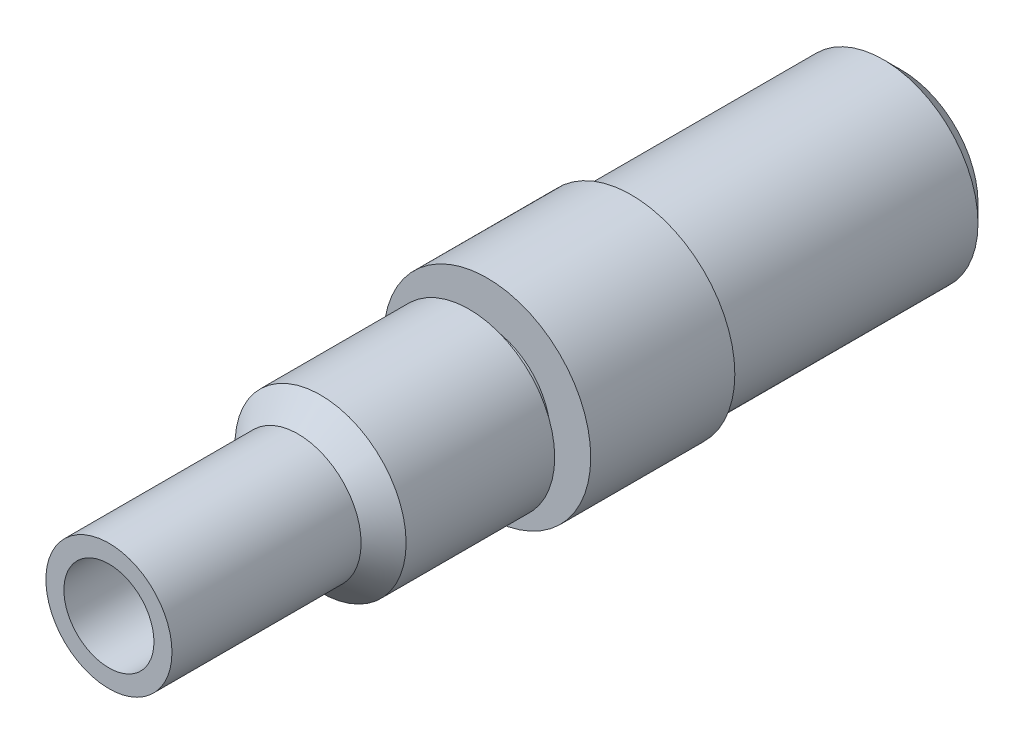
ISO-10303-21;
HEADER;
FILE_DESCRIPTION(('STEP AP214'),'2;1');
FILE_NAME('part.step','',(''),(''),'','','');
FILE_SCHEMA(('AUTOMOTIVE_DESIGN { 1 0 10303 214 1 1 1 1 }'));
ENDSEC;
DATA;
#1=APPLICATION_CONTEXT('core data for automotive mechanical design processes');
#2=APPLICATION_PROTOCOL_DEFINITION('international standard','automotive_design',2000,#1);
#3=PRODUCT_CONTEXT('',#1,'mechanical');
#4=PRODUCT('Part','Part','',(#3));
#5=PRODUCT_RELATED_PRODUCT_CATEGORY('part','',(#4));
#6=PRODUCT_DEFINITION_FORMATION('','',#4);
#7=PRODUCT_DEFINITION_CONTEXT('part definition',#1,'design');
#8=PRODUCT_DEFINITION('design','',#6,#7);
#9=PRODUCT_DEFINITION_SHAPE('','',#8);
#10=(LENGTH_UNIT() NAMED_UNIT(*) SI_UNIT(.MILLI.,.METRE.));
#11=(NAMED_UNIT(*) PLANE_ANGLE_UNIT() SI_UNIT($,.RADIAN.));
#12=(NAMED_UNIT(*) SI_UNIT($,.STERADIAN.) SOLID_ANGLE_UNIT());
#13=UNCERTAINTY_MEASURE_WITH_UNIT(LENGTH_MEASURE(1.E-05),#10,'distance_accuracy_value','');
#14=(GEOMETRIC_REPRESENTATION_CONTEXT(3) GLOBAL_UNCERTAINTY_ASSIGNED_CONTEXT((#13)) GLOBAL_UNIT_ASSIGNED_CONTEXT((#10,
#11,#12)) REPRESENTATION_CONTEXT('',''));
#15=CARTESIAN_POINT('',(0.,0.,0.));
#16=DIRECTION('',(0.,0.,1.));
#17=DIRECTION('',(1.,0.,0.));
#18=AXIS2_PLACEMENT_3D('',#15,#16,#17);
#19=CARTESIAN_POINT('',(0.,0.,23.));
#20=DIRECTION('',(0.,0.,1.));
#21=DIRECTION('',(1.,0.,0.));
#22=AXIS2_PLACEMENT_3D('',#19,#20,#21);
#23=PLANE('',#22);
#24=CARTESIAN_POINT('',(0.,0.,23.));
#25=DIRECTION('',(0.,0.,1.));
#26=DIRECTION('',(1.,0.,0.));
#27=AXIS2_PLACEMENT_3D('',#24,#25,#26);
#28=CIRCLE('',#27,5.75);
#29=CARTESIAN_POINT('',(5.75,0.,23.));
#30=VERTEX_POINT('',#29);
#31=EDGE_CURVE('E75',#30,#30,#28,.T.);
#32=ORIENTED_EDGE('',*,*,#31,.T.);
#33=EDGE_LOOP('',(#32));
#34=FACE_BOUND('',#33,.T.);
#35=CARTESIAN_POINT('',(0.,0.,23.));
#36=DIRECTION('',(0.,0.,1.));
#37=DIRECTION('',(1.,0.,0.));
#38=AXIS2_PLACEMENT_3D('',#35,#36,#37);
#39=CIRCLE('',#38,3.5);
#40=CARTESIAN_POINT('',(3.5,0.,23.));
#41=VERTEX_POINT('',#40);
#42=EDGE_CURVE('E82',#41,#41,#39,.T.);
#43=ORIENTED_EDGE('',*,*,#42,.F.);
#44=EDGE_LOOP('',(#43));
#45=FACE_BOUND('',#44,.T.);
#46=ADVANCED_FACE('F51',(#34,#45),#23,.T.);
#47=CARTESIAN_POINT('',(0.,0.,0.));
#48=DIRECTION('',(0.,0.,1.));
#49=DIRECTION('',(1.,0.,0.));
#50=AXIS2_PLACEMENT_3D('',#47,#48,#49);
#51=PLANE('',#50);
#52=CARTESIAN_POINT('',(0.,0.,0.));
#53=DIRECTION('',(0.,0.,1.));
#54=DIRECTION('',(1.,0.,0.));
#55=AXIS2_PLACEMENT_3D('',#52,#53,#54);
#56=CIRCLE('',#55,4.24999999999999);
#57=CARTESIAN_POINT('',(4.24999999999999,0.,0.));
#58=VERTEX_POINT('',#57);
#59=EDGE_CURVE('E10',#58,#58,#56,.F.);
#60=ORIENTED_EDGE('',*,*,#59,.T.);
#61=EDGE_LOOP('',(#60));
#62=FACE_BOUND('',#61,.T.);
#63=CARTESIAN_POINT('',(0.,0.,0.));
#64=DIRECTION('',(0.,0.,1.));
#65=DIRECTION('',(1.,0.,0.));
#66=AXIS2_PLACEMENT_3D('',#63,#64,#65);
#67=CIRCLE('',#66,2.5);
#68=CARTESIAN_POINT('',(2.5,0.,0.));
#69=VERTEX_POINT('',#68);
#70=EDGE_CURVE('E72',#69,#69,#67,.T.);
#71=ORIENTED_EDGE('',*,*,#70,.T.);
#72=EDGE_LOOP('',(#71));
#73=FACE_BOUND('',#72,.T.);
#74=ADVANCED_FACE('F120',(#62,#73),#51,.F.);
#75=CARTESIAN_POINT('',(0.,0.,15.));
#76=DIRECTION('',(0.,0.,-1.));
#77=DIRECTION('',(-1.,0.,0.));
#78=AXIS2_PLACEMENT_3D('',#75,#76,#77);
#79=CYLINDRICAL_SURFACE('',#78,5.25);
#80=CARTESIAN_POINT('',(0.,0.,1.));
#81=DIRECTION('',(0.,0.,1.));
#82=DIRECTION('',(1.,0.,0.));
#83=AXIS2_PLACEMENT_3D('',#80,#81,#82);
#84=CIRCLE('',#83,5.25);
#85=CARTESIAN_POINT('',(5.25,0.,1.));
#86=VERTEX_POINT('',#85);
#87=EDGE_CURVE('E59',#86,#86,#84,.T.);
#88=ORIENTED_EDGE('',*,*,#87,.T.);
#89=EDGE_LOOP('',(#88));
#90=FACE_BOUND('',#89,.T.);
#91=CARTESIAN_POINT('',(0.,0.,15.));
#92=DIRECTION('',(0.,0.,1.));
#93=DIRECTION('',(1.,0.,0.));
#94=AXIS2_PLACEMENT_3D('',#91,#92,#93);
#95=CIRCLE('',#94,5.25);
#96=CARTESIAN_POINT('',(5.25,0.,15.));
#97=VERTEX_POINT('',#96);
#98=EDGE_CURVE('E67',#97,#97,#95,.T.);
#99=ORIENTED_EDGE('',*,*,#98,.F.);
#100=EDGE_LOOP('',(#99));
#101=FACE_BOUND('',#100,.T.);
#102=ADVANCED_FACE('F128',(#90,#101),#79,.T.);
#103=CARTESIAN_POINT('',(0.,0.,15.));
#104=DIRECTION('',(0.,0.,-1.));
#105=DIRECTION('',(-1.,0.,0.));
#106=AXIS2_PLACEMENT_3D('',#103,#104,#105);
#107=CYLINDRICAL_SURFACE('',#106,2.5);
#108=ORIENTED_EDGE('',*,*,#70,.F.);
#109=EDGE_LOOP('',(#108));
#110=FACE_BOUND('',#109,.T.);
#111=CARTESIAN_POINT('',(0.,0.,44.));
#112=DIRECTION('',(0.,0.,1.));
#113=DIRECTION('',(1.,0.,0.));
#114=AXIS2_PLACEMENT_3D('',#111,#112,#113);
#115=CIRCLE('',#114,2.5);
#116=CARTESIAN_POINT('',(2.5,0.,44.));
#117=VERTEX_POINT('',#116);
#118=EDGE_CURVE('E96',#117,#117,#115,.T.);
#119=ORIENTED_EDGE('',*,*,#118,.T.);
#120=EDGE_LOOP('',(#119));
#121=FACE_BOUND('',#120,.T.);
#122=ADVANCED_FACE('F100',(#110,#121),#107,.F.);
#123=CARTESIAN_POINT('',(0.,0.,15.));
#124=DIRECTION('',(0.,0.,1.));
#125=DIRECTION('',(1.,0.,0.));
#126=AXIS2_PLACEMENT_3D('',#123,#124,#125);
#127=PLANE('',#126);
#128=ORIENTED_EDGE('',*,*,#98,.T.);
#129=EDGE_LOOP('',(#128));
#130=FACE_BOUND('',#129,.T.);
#131=CARTESIAN_POINT('',(0.,0.,15.));
#132=DIRECTION('',(0.,0.,1.));
#133=DIRECTION('',(1.,0.,0.));
#134=AXIS2_PLACEMENT_3D('',#131,#132,#133);
#135=CIRCLE('',#134,5.75);
#136=CARTESIAN_POINT('',(5.75,0.,15.));
#137=VERTEX_POINT('',#136);
#138=EDGE_CURVE('E76',#137,#137,#135,.T.);
#139=ORIENTED_EDGE('',*,*,#138,.F.);
#140=EDGE_LOOP('',(#139));
#141=FACE_BOUND('',#140,.T.);
#142=ADVANCED_FACE('F134',(#130,#141),#127,.F.);
#143=CARTESIAN_POINT('',(0.,0.,23.));
#144=DIRECTION('',(0.,0.,-1.));
#145=DIRECTION('',(-1.,0.,0.));
#146=AXIS2_PLACEMENT_3D('',#143,#144,#145);
#147=CYLINDRICAL_SURFACE('',#146,5.75);
#148=ORIENTED_EDGE('',*,*,#31,.F.);
#149=EDGE_LOOP('',(#148));
#150=FACE_BOUND('',#149,.T.);
#151=ORIENTED_EDGE('',*,*,#138,.T.);
#152=EDGE_LOOP('',(#151));
#153=FACE_BOUND('',#152,.T.);
#154=ADVANCED_FACE('F137',(#150,#153),#147,.T.);
#155=CARTESIAN_POINT('',(0.,0.,24.));
#156=DIRECTION('',(0.,0.,-1.));
#157=DIRECTION('',(-1.,0.,0.));
#158=AXIS2_PLACEMENT_3D('',#155,#156,#157);
#159=CYLINDRICAL_SURFACE('',#158,3.5);
#160=CARTESIAN_POINT('',(0.,0.,24.));
#161=DIRECTION('',(0.,0.,1.));
#162=DIRECTION('',(1.,0.,0.));
#163=AXIS2_PLACEMENT_3D('',#160,#161,#162);
#164=CIRCLE('',#163,3.5);
#165=CARTESIAN_POINT('',(3.5,0.,24.));
#166=VERTEX_POINT('',#165);
#167=EDGE_CURVE('E79',#166,#166,#164,.T.);
#168=ORIENTED_EDGE('',*,*,#167,.F.);
#169=EDGE_LOOP('',(#168));
#170=FACE_BOUND('',#169,.T.);
#171=ORIENTED_EDGE('',*,*,#42,.T.);
#172=EDGE_LOOP('',(#171));
#173=FACE_BOUND('',#172,.T.);
#174=ADVANCED_FACE('F133',(#170,#173),#159,.T.);
#175=CARTESIAN_POINT('',(0.,0.,24.));
#176=DIRECTION('',(0.,0.,1.));
#177=DIRECTION('',(1.,0.,0.));
#178=AXIS2_PLACEMENT_3D('',#175,#176,#177);
#179=PLANE('',#178);
#180=ORIENTED_EDGE('',*,*,#167,.T.);
#181=EDGE_LOOP('',(#180));
#182=FACE_BOUND('',#181,.T.);
#183=CARTESIAN_POINT('',(0.,0.,24.));
#184=DIRECTION('',(0.,0.,1.));
#185=DIRECTION('',(1.,0.,0.));
#186=AXIS2_PLACEMENT_3D('',#183,#184,#185);
#187=CIRCLE('',#186,4.75);
#188=CARTESIAN_POINT('',(4.75,0.,24.));
#189=VERTEX_POINT('',#188);
#190=EDGE_CURVE('E88',#189,#189,#187,.T.);
#191=ORIENTED_EDGE('',*,*,#190,.F.);
#192=EDGE_LOOP('',(#191));
#193=FACE_BOUND('',#192,.T.);
#194=ADVANCED_FACE('F116',(#182,#193),#179,.F.);
#195=CARTESIAN_POINT('',(0.,0.,32.25));
#196=DIRECTION('',(0.,0.,-1.));
#197=DIRECTION('',(-1.,0.,0.));
#198=AXIS2_PLACEMENT_3D('',#195,#196,#197);
#199=CYLINDRICAL_SURFACE('',#198,4.75);
#200=CARTESIAN_POINT('',(0.,0.,32.25));
#201=DIRECTION('',(0.,0.,1.));
#202=DIRECTION('',(1.,0.,0.));
#203=AXIS2_PLACEMENT_3D('',#200,#201,#202);
#204=CIRCLE('',#203,4.75);
#205=CARTESIAN_POINT('',(4.75,0.,32.25));
#206=VERTEX_POINT('',#205);
#207=EDGE_CURVE('E85',#206,#206,#204,.T.);
#208=ORIENTED_EDGE('',*,*,#207,.F.);
#209=EDGE_LOOP('',(#208));
#210=FACE_BOUND('',#209,.T.);
#211=ORIENTED_EDGE('',*,*,#190,.T.);
#212=EDGE_LOOP('',(#211));
#213=FACE_BOUND('',#212,.T.);
#214=ADVANCED_FACE('F105',(#210,#213),#199,.T.);
#215=CARTESIAN_POINT('',(0.,0.,44.));
#216=DIRECTION('',(0.,0.,1.));
#217=DIRECTION('',(1.,0.,0.));
#218=AXIS2_PLACEMENT_3D('',#215,#216,#217);
#219=PLANE('',#218);
#220=CARTESIAN_POINT('',(0.,0.,44.));
#221=DIRECTION('',(0.,0.,1.));
#222=DIRECTION('',(1.,0.,0.));
#223=AXIS2_PLACEMENT_3D('',#220,#221,#222);
#224=CIRCLE('',#223,3.5);
#225=CARTESIAN_POINT('',(3.5,0.,44.));
#226=VERTEX_POINT('',#225);
#227=EDGE_CURVE('E91',#226,#226,#224,.T.);
#228=ORIENTED_EDGE('',*,*,#227,.T.);
#229=EDGE_LOOP('',(#228));
#230=FACE_BOUND('',#229,.T.);
#231=ORIENTED_EDGE('',*,*,#118,.F.);
#232=EDGE_LOOP('',(#231));
#233=FACE_BOUND('',#232,.T.);
#234=ADVANCED_FACE('F102',(#230,#233),#219,.T.);
#235=CARTESIAN_POINT('',(0.,0.,44.));
#236=DIRECTION('',(0.,0.,-1.));
#237=DIRECTION('',(-1.,0.,0.));
#238=AXIS2_PLACEMENT_3D('',#235,#236,#237);
#239=CYLINDRICAL_SURFACE('',#238,3.5);
#240=CARTESIAN_POINT('',(0.,0.,33.5));
#241=DIRECTION('',(0.,0.,1.));
#242=DIRECTION('',(1.,0.,0.));
#243=AXIS2_PLACEMENT_3D('',#240,#241,#242);
#244=CIRCLE('',#243,3.5);
#245=CARTESIAN_POINT('',(3.5,0.,33.5));
#246=VERTEX_POINT('',#245);
#247=EDGE_CURVE('E63',#246,#246,#244,.T.);
#248=ORIENTED_EDGE('',*,*,#247,.T.);
#249=EDGE_LOOP('',(#248));
#250=FACE_BOUND('',#249,.T.);
#251=ORIENTED_EDGE('',*,*,#227,.F.);
#252=EDGE_LOOP('',(#251));
#253=FACE_BOUND('',#252,.T.);
#254=ADVANCED_FACE('F104',(#250,#253),#239,.T.);
#255=CARTESIAN_POINT('',(0.,0.,33.5));
#256=DIRECTION('',(0.,0.,-1.));
#257=DIRECTION('',(-1.,0.,0.));
#258=AXIS2_PLACEMENT_3D('',#255,#256,#257);
#259=CONICAL_SURFACE('',#258,3.5,0.785398163397441);
#260=ORIENTED_EDGE('',*,*,#207,.T.);
#261=EDGE_LOOP('',(#260));
#262=FACE_BOUND('',#261,.T.);
#263=ORIENTED_EDGE('',*,*,#247,.F.);
#264=EDGE_LOOP('',(#263));
#265=FACE_BOUND('',#264,.T.);
#266=ADVANCED_FACE('F112',(#262,#265),#259,.T.);
#267=CARTESIAN_POINT('',(0.,0.,1.));
#268=DIRECTION('',(0.,0.,1.));
#269=DIRECTION('',(1.,0.,0.));
#270=AXIS2_PLACEMENT_3D('',#267,#268,#269);
#271=CONICAL_SURFACE('',#270,5.25,0.785398163397451);
#272=ORIENTED_EDGE('',*,*,#59,.F.);
#273=EDGE_LOOP('',(#272));
#274=FACE_BOUND('',#273,.T.);
#275=ORIENTED_EDGE('',*,*,#87,.F.);
#276=EDGE_LOOP('',(#275));
#277=FACE_BOUND('',#276,.T.);
#278=ADVANCED_FACE('F54',(#274,#277),#271,.T.);
#279=CLOSED_SHELL('',(#46,#74,#102,#122,#142,#154,#174,#194,#214,#234,#254,#266,#278));
#280=MANIFOLD_SOLID_BREP('B2',#279);
#281=ADVANCED_BREP_SHAPE_REPRESENTATION('',(#18,#280),#14);
#282=SHAPE_DEFINITION_REPRESENTATION(#9,#281);
ENDSEC;
END-ISO-10303-21;
